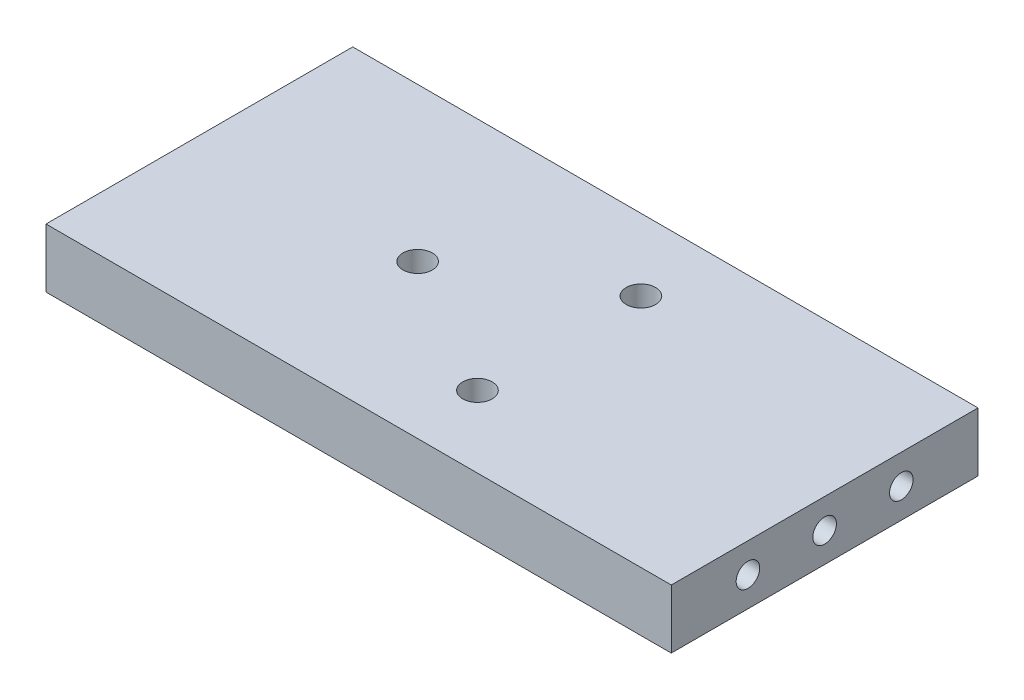
ISO-10303-21;
HEADER;
FILE_DESCRIPTION(('STEP AP214'),'2;1');
FILE_NAME('part.step','',(''),(''),'','','');
FILE_SCHEMA(('AUTOMOTIVE_DESIGN { 1 0 10303 214 1 1 1 1 }'));
ENDSEC;
DATA;
#1=APPLICATION_CONTEXT('core data for automotive mechanical design processes');
#2=APPLICATION_PROTOCOL_DEFINITION('international standard','automotive_design',2000,#1);
#3=PRODUCT_CONTEXT('',#1,'mechanical');
#4=PRODUCT('Part','Part','',(#3));
#5=PRODUCT_RELATED_PRODUCT_CATEGORY('part','',(#4));
#6=PRODUCT_DEFINITION_FORMATION('','',#4);
#7=PRODUCT_DEFINITION_CONTEXT('part definition',#1,'design');
#8=PRODUCT_DEFINITION('design','',#6,#7);
#9=PRODUCT_DEFINITION_SHAPE('','',#8);
#10=(LENGTH_UNIT() NAMED_UNIT(*) SI_UNIT(.MILLI.,.METRE.));
#11=(NAMED_UNIT(*) PLANE_ANGLE_UNIT() SI_UNIT($,.RADIAN.));
#12=(NAMED_UNIT(*) SI_UNIT($,.STERADIAN.) SOLID_ANGLE_UNIT());
#13=UNCERTAINTY_MEASURE_WITH_UNIT(LENGTH_MEASURE(1.E-05),#10,'distance_accuracy_value','');
#14=(GEOMETRIC_REPRESENTATION_CONTEXT(3) GLOBAL_UNCERTAINTY_ASSIGNED_CONTEXT((#13)) GLOBAL_UNIT_ASSIGNED_CONTEXT((#10,
#11,#12)) REPRESENTATION_CONTEXT('',''));
#15=CARTESIAN_POINT('',(0.,0.,0.));
#16=DIRECTION('',(0.,0.,1.));
#17=DIRECTION('',(1.,0.,0.));
#18=AXIS2_PLACEMENT_3D('',#15,#16,#17);
#19=CARTESIAN_POINT('',(0.,5.,0.));
#20=DIRECTION('',(1.,0.,0.));
#21=DIRECTION('',(0.,0.,-1.));
#22=AXIS2_PLACEMENT_3D('',#19,#20,#21);
#23=PLANE('',#22);
#24=CARTESIAN_POINT('',(0.,2.5,-19.5));
#25=DIRECTION('',(-1.,0.,0.));
#26=DIRECTION('',(0.,0.,1.));
#27=AXIS2_PLACEMENT_3D('',#24,#25,#26);
#28=CIRCLE('',#27,0.999999999999989);
#29=CARTESIAN_POINT('',(0.,2.5,-18.5));
#30=VERTEX_POINT('',#29);
#31=EDGE_CURVE('E124',#30,#30,#28,.T.);
#32=ORIENTED_EDGE('',*,*,#31,.F.);
#33=EDGE_LOOP('',(#32));
#34=FACE_BOUND('',#33,.T.);
#35=CARTESIAN_POINT('',(0.,2.5,-13.));
#36=DIRECTION('',(-1.,0.,0.));
#37=DIRECTION('',(0.,0.,1.));
#38=AXIS2_PLACEMENT_3D('',#35,#36,#37);
#39=CIRCLE('',#38,0.999999999999989);
#40=CARTESIAN_POINT('',(0.,2.5,-12.));
#41=VERTEX_POINT('',#40);
#42=EDGE_CURVE('E123',#41,#41,#39,.T.);
#43=ORIENTED_EDGE('',*,*,#42,.F.);
#44=EDGE_LOOP('',(#43));
#45=FACE_BOUND('',#44,.T.);
#46=CARTESIAN_POINT('',(0.,2.5,-6.5));
#47=DIRECTION('',(-1.,0.,0.));
#48=DIRECTION('',(0.,0.,1.));
#49=AXIS2_PLACEMENT_3D('',#46,#47,#48);
#50=CIRCLE('',#49,0.999999999999989);
#51=CARTESIAN_POINT('',(0.,2.5,-5.50000000000001));
#52=VERTEX_POINT('',#51);
#53=EDGE_CURVE('E139',#52,#52,#50,.T.);
#54=ORIENTED_EDGE('',*,*,#53,.F.);
#55=EDGE_LOOP('',(#54));
#56=FACE_BOUND('',#55,.T.);
#57=DIRECTION('',(0.,0.,1.));
#58=VECTOR('',#57,1.);
#59=CARTESIAN_POINT('',(0.,0.,0.));
#60=LINE('',#59,#58);
#61=CARTESIAN_POINT('',(0.,0.,-26.));
#62=VERTEX_POINT('',#61);
#63=CARTESIAN_POINT('',(0.,0.,0.));
#64=VERTEX_POINT('',#63);
#65=EDGE_CURVE('E171',#62,#64,#60,.T.);
#66=ORIENTED_EDGE('',*,*,#65,.T.);
#67=DIRECTION('',(0.,-1.,0.));
#68=VECTOR('',#67,1.);
#69=CARTESIAN_POINT('',(0.,5.,0.));
#70=LINE('',#69,#68);
#71=CARTESIAN_POINT('',(0.,5.,0.));
#72=VERTEX_POINT('',#71);
#73=EDGE_CURVE('E11',#72,#64,#70,.T.);
#74=ORIENTED_EDGE('',*,*,#73,.F.);
#75=DIRECTION('',(0.,0.,1.));
#76=VECTOR('',#75,1.);
#77=CARTESIAN_POINT('',(0.,5.,0.));
#78=LINE('',#77,#76);
#79=CARTESIAN_POINT('',(0.,5.,-26.));
#80=VERTEX_POINT('',#79);
#81=EDGE_CURVE('E172',#80,#72,#78,.T.);
#82=ORIENTED_EDGE('',*,*,#81,.F.);
#83=DIRECTION('',(0.,-1.,0.));
#84=VECTOR('',#83,1.);
#85=CARTESIAN_POINT('',(0.,5.,-26.));
#86=LINE('',#85,#84);
#87=EDGE_CURVE('E182',#80,#62,#86,.T.);
#88=ORIENTED_EDGE('',*,*,#87,.T.);
#89=EDGE_LOOP('',(#66,#74,#82,#88));
#90=FACE_BOUND('',#89,.T.);
#91=ADVANCED_FACE('F45',(#34,#45,#56,#90),#23,.F.);
#92=CARTESIAN_POINT('',(0.,5.,0.));
#93=DIRECTION('',(0.,0.,-1.));
#94=DIRECTION('',(-1.,0.,0.));
#95=AXIS2_PLACEMENT_3D('',#92,#93,#94);
#96=PLANE('',#95);
#97=DIRECTION('',(1.,0.,0.));
#98=VECTOR('',#97,1.);
#99=CARTESIAN_POINT('',(0.,0.,0.));
#100=LINE('',#99,#98);
#101=CARTESIAN_POINT('',(53.,0.,0.));
#102=VERTEX_POINT('',#101);
#103=EDGE_CURVE('E186',#64,#102,#100,.T.);
#104=ORIENTED_EDGE('',*,*,#103,.T.);
#105=DIRECTION('',(0.,-1.,0.));
#106=VECTOR('',#105,1.);
#107=CARTESIAN_POINT('',(53.,5.,0.));
#108=LINE('',#107,#106);
#109=CARTESIAN_POINT('',(53.,5.,0.));
#110=VERTEX_POINT('',#109);
#111=EDGE_CURVE('E54',#110,#102,#108,.T.);
#112=ORIENTED_EDGE('',*,*,#111,.F.);
#113=DIRECTION('',(1.,0.,0.));
#114=VECTOR('',#113,1.);
#115=CARTESIAN_POINT('',(0.,5.,0.));
#116=LINE('',#115,#114);
#117=EDGE_CURVE('E93',#72,#110,#116,.T.);
#118=ORIENTED_EDGE('',*,*,#117,.F.);
#119=ORIENTED_EDGE('',*,*,#73,.T.);
#120=EDGE_LOOP('',(#104,#112,#118,#119));
#121=FACE_BOUND('',#120,.T.);
#122=ADVANCED_FACE('F217',(#121),#96,.F.);
#123=CARTESIAN_POINT('',(53.,5.,0.));
#124=DIRECTION('',(-1.,0.,0.));
#125=DIRECTION('',(0.,0.,1.));
#126=AXIS2_PLACEMENT_3D('',#123,#124,#125);
#127=PLANE('',#126);
#128=CARTESIAN_POINT('',(53.,2.5,-6.5));
#129=DIRECTION('',(1.,0.,0.));
#130=DIRECTION('',(0.,0.,-1.));
#131=AXIS2_PLACEMENT_3D('',#128,#129,#130);
#132=CIRCLE('',#131,0.999999999999989);
#133=CARTESIAN_POINT('',(53.,2.5,-7.49999999999999));
#134=VERTEX_POINT('',#133);
#135=EDGE_CURVE('E147',#134,#134,#132,.T.);
#136=ORIENTED_EDGE('',*,*,#135,.F.);
#137=EDGE_LOOP('',(#136));
#138=FACE_BOUND('',#137,.T.);
#139=CARTESIAN_POINT('',(53.,2.5,-13.));
#140=DIRECTION('',(1.,0.,0.));
#141=DIRECTION('',(0.,0.,-1.));
#142=AXIS2_PLACEMENT_3D('',#139,#140,#141);
#143=CIRCLE('',#142,0.999999999999989);
#144=CARTESIAN_POINT('',(53.,2.5,-14.));
#145=VERTEX_POINT('',#144);
#146=EDGE_CURVE('E155',#145,#145,#143,.T.);
#147=ORIENTED_EDGE('',*,*,#146,.F.);
#148=EDGE_LOOP('',(#147));
#149=FACE_BOUND('',#148,.T.);
#150=CARTESIAN_POINT('',(53.,2.5,-19.5));
#151=DIRECTION('',(1.,0.,0.));
#152=DIRECTION('',(0.,0.,-1.));
#153=AXIS2_PLACEMENT_3D('',#150,#151,#152);
#154=CIRCLE('',#153,0.999999999999989);
#155=CARTESIAN_POINT('',(53.,2.5,-20.5));
#156=VERTEX_POINT('',#155);
#157=EDGE_CURVE('E163',#156,#156,#154,.T.);
#158=ORIENTED_EDGE('',*,*,#157,.F.);
#159=EDGE_LOOP('',(#158));
#160=FACE_BOUND('',#159,.T.);
#161=DIRECTION('',(0.,0.,-1.));
#162=VECTOR('',#161,1.);
#163=CARTESIAN_POINT('',(53.,0.,0.));
#164=LINE('',#163,#162);
#165=CARTESIAN_POINT('',(53.,0.,-26.));
#166=VERTEX_POINT('',#165);
#167=EDGE_CURVE('E80',#102,#166,#164,.T.);
#168=ORIENTED_EDGE('',*,*,#167,.T.);
#169=DIRECTION('',(0.,-1.,0.));
#170=VECTOR('',#169,1.);
#171=CARTESIAN_POINT('',(53.,5.,-26.));
#172=LINE('',#171,#170);
#173=CARTESIAN_POINT('',(53.,5.,-26.));
#174=VERTEX_POINT('',#173);
#175=EDGE_CURVE('E195',#174,#166,#172,.T.);
#176=ORIENTED_EDGE('',*,*,#175,.F.);
#177=DIRECTION('',(0.,0.,-1.));
#178=VECTOR('',#177,1.);
#179=CARTESIAN_POINT('',(53.,5.,0.));
#180=LINE('',#179,#178);
#181=EDGE_CURVE('E177',#110,#174,#180,.T.);
#182=ORIENTED_EDGE('',*,*,#181,.F.);
#183=ORIENTED_EDGE('',*,*,#111,.T.);
#184=EDGE_LOOP('',(#168,#176,#182,#183));
#185=FACE_BOUND('',#184,.T.);
#186=ADVANCED_FACE('F199',(#138,#149,#160,#185),#127,.F.);
#187=CARTESIAN_POINT('',(0.,5.,-26.));
#188=DIRECTION('',(0.,0.,1.));
#189=DIRECTION('',(1.,0.,0.));
#190=AXIS2_PLACEMENT_3D('',#187,#188,#189);
#191=PLANE('',#190);
#192=DIRECTION('',(-1.,0.,0.));
#193=VECTOR('',#192,1.);
#194=CARTESIAN_POINT('',(0.,0.,-26.));
#195=LINE('',#194,#193);
#196=EDGE_CURVE('E86',#166,#62,#195,.T.);
#197=ORIENTED_EDGE('',*,*,#196,.T.);
#198=ORIENTED_EDGE('',*,*,#87,.F.);
#199=DIRECTION('',(-1.,0.,0.));
#200=VECTOR('',#199,1.);
#201=CARTESIAN_POINT('',(0.,5.,-26.));
#202=LINE('',#201,#200);
#203=EDGE_CURVE('E62',#174,#80,#202,.T.);
#204=ORIENTED_EDGE('',*,*,#203,.F.);
#205=ORIENTED_EDGE('',*,*,#175,.T.);
#206=EDGE_LOOP('',(#197,#198,#204,#205));
#207=FACE_BOUND('',#206,.T.);
#208=ADVANCED_FACE('F206',(#207),#191,.F.);
#209=CARTESIAN_POINT('',(0.,5.,0.));
#210=DIRECTION('',(0.,-1.,0.));
#211=DIRECTION('',(0.,0.,-1.));
#212=AXIS2_PLACEMENT_3D('',#209,#210,#211);
#213=PLANE('',#212);
#214=CARTESIAN_POINT('',(18.5,5.,-13.));
#215=DIRECTION('',(0.,1.,0.));
#216=DIRECTION('',(0.,0.,1.));
#217=AXIS2_PLACEMENT_3D('',#214,#215,#216);
#218=CIRCLE('',#217,1.24999999999999);
#219=CARTESIAN_POINT('',(18.5,5.,-11.75));
#220=VERTEX_POINT('',#219);
#221=EDGE_CURVE('E301',#220,#220,#218,.T.);
#222=ORIENTED_EDGE('',*,*,#221,.F.);
#223=EDGE_LOOP('',(#222));
#224=FACE_BOUND('',#223,.T.);
#225=CARTESIAN_POINT('',(30.5,5.,-19.9282032302755));
#226=DIRECTION('',(0.,1.,0.));
#227=DIRECTION('',(0.,0.,1.));
#228=AXIS2_PLACEMENT_3D('',#225,#226,#227);
#229=CIRCLE('',#228,1.24999999999999);
#230=CARTESIAN_POINT('',(30.5,5.,-18.6782032302755));
#231=VERTEX_POINT('',#230);
#232=EDGE_CURVE('E295',#231,#231,#229,.T.);
#233=ORIENTED_EDGE('',*,*,#232,.F.);
#234=EDGE_LOOP('',(#233));
#235=FACE_BOUND('',#234,.T.);
#236=CARTESIAN_POINT('',(30.5,5.,-6.07179676972449));
#237=DIRECTION('',(0.,1.,0.));
#238=DIRECTION('',(0.,0.,1.));
#239=AXIS2_PLACEMENT_3D('',#236,#237,#238);
#240=CIRCLE('',#239,1.24999999999999);
#241=CARTESIAN_POINT('',(30.5,5.,-4.8217967697245));
#242=VERTEX_POINT('',#241);
#243=EDGE_CURVE('E288',#242,#242,#240,.T.);
#244=ORIENTED_EDGE('',*,*,#243,.F.);
#245=EDGE_LOOP('',(#244));
#246=FACE_BOUND('',#245,.T.);
#247=ORIENTED_EDGE('',*,*,#81,.T.);
#248=ORIENTED_EDGE('',*,*,#117,.T.);
#249=ORIENTED_EDGE('',*,*,#181,.T.);
#250=ORIENTED_EDGE('',*,*,#203,.T.);
#251=EDGE_LOOP('',(#247,#248,#249,#250));
#252=FACE_BOUND('',#251,.T.);
#253=ADVANCED_FACE('F208',(#224,#235,#246,#252),#213,.F.);
#254=CARTESIAN_POINT('',(0.,0.,0.));
#255=DIRECTION('',(0.,-1.,0.));
#256=DIRECTION('',(0.,0.,-1.));
#257=AXIS2_PLACEMENT_3D('',#254,#255,#256);
#258=PLANE('',#257);
#259=CARTESIAN_POINT('',(18.5,0.,-13.));
#260=DIRECTION('',(0.,1.,0.));
#261=DIRECTION('',(0.,0.,1.));
#262=AXIS2_PLACEMENT_3D('',#259,#260,#261);
#263=CIRCLE('',#262,1.25);
#264=CARTESIAN_POINT('',(18.5,0.,-11.75));
#265=VERTEX_POINT('',#264);
#266=EDGE_CURVE('E279',#265,#265,#263,.T.);
#267=ORIENTED_EDGE('',*,*,#266,.T.);
#268=EDGE_LOOP('',(#267));
#269=FACE_BOUND('',#268,.T.);
#270=CARTESIAN_POINT('',(30.5,0.,-19.9282032302755));
#271=DIRECTION('',(0.,1.,0.));
#272=DIRECTION('',(0.,0.,1.));
#273=AXIS2_PLACEMENT_3D('',#270,#271,#272);
#274=CIRCLE('',#273,1.25);
#275=CARTESIAN_POINT('',(30.5,0.,-18.6782032302755));
#276=VERTEX_POINT('',#275);
#277=EDGE_CURVE('E283',#276,#276,#274,.T.);
#278=ORIENTED_EDGE('',*,*,#277,.T.);
#279=EDGE_LOOP('',(#278));
#280=FACE_BOUND('',#279,.T.);
#281=CARTESIAN_POINT('',(30.5,0.,-6.07179676972449));
#282=DIRECTION('',(0.,1.,0.));
#283=DIRECTION('',(0.,0.,1.));
#284=AXIS2_PLACEMENT_3D('',#281,#282,#283);
#285=CIRCLE('',#284,1.25);
#286=CARTESIAN_POINT('',(30.5,0.,-4.82179676972449));
#287=VERTEX_POINT('',#286);
#288=EDGE_CURVE('E132',#287,#287,#285,.T.);
#289=ORIENTED_EDGE('',*,*,#288,.T.);
#290=EDGE_LOOP('',(#289));
#291=FACE_BOUND('',#290,.T.);
#292=ORIENTED_EDGE('',*,*,#65,.F.);
#293=ORIENTED_EDGE('',*,*,#196,.F.);
#294=ORIENTED_EDGE('',*,*,#167,.F.);
#295=ORIENTED_EDGE('',*,*,#103,.F.);
#296=EDGE_LOOP('',(#292,#293,#294,#295));
#297=FACE_BOUND('',#296,.T.);
#298=ADVANCED_FACE('F202',(#269,#280,#291,#297),#258,.T.);
#299=CARTESIAN_POINT('',(46.,2.5,-19.5));
#300=DIRECTION('',(1.,0.,0.));
#301=DIRECTION('',(0.,0.,-1.));
#302=AXIS2_PLACEMENT_3D('',#299,#300,#301);
#303=CONICAL_SURFACE('',#302,0.999999999999987,1.02974425867664);
#304=CARTESIAN_POINT('',(45.3991393809724,2.5,-19.5));
#305=VERTEX_POINT('',#304);
#306=VERTEX_LOOP('',#305);
#307=FACE_BOUND('',#306,.T.);
#308=CARTESIAN_POINT('',(46.,2.5,-19.5));
#309=DIRECTION('',(1.,0.,0.));
#310=DIRECTION('',(0.,0.,-1.));
#311=AXIS2_PLACEMENT_3D('',#308,#309,#310);
#312=CIRCLE('',#311,0.999999999999987);
#313=CARTESIAN_POINT('',(46.,2.5,-20.5));
#314=VERTEX_POINT('',#313);
#315=EDGE_CURVE('E167',#314,#314,#312,.T.);
#316=ORIENTED_EDGE('',*,*,#315,.T.);
#317=EDGE_LOOP('',(#316));
#318=FACE_BOUND('',#317,.T.);
#319=ADVANCED_FACE('F267',(#307,#318),#303,.F.);
#320=CARTESIAN_POINT('',(53.,2.5,-19.5));
#321=DIRECTION('',(1.,0.,0.));
#322=DIRECTION('',(0.,0.,-1.));
#323=AXIS2_PLACEMENT_3D('',#320,#321,#322);
#324=CYLINDRICAL_SURFACE('',#323,0.999999999999988);
#325=ORIENTED_EDGE('',*,*,#315,.F.);
#326=EDGE_LOOP('',(#325));
#327=FACE_BOUND('',#326,.T.);
#328=ORIENTED_EDGE('',*,*,#157,.T.);
#329=EDGE_LOOP('',(#328));
#330=FACE_BOUND('',#329,.T.);
#331=ADVANCED_FACE('F263',(#327,#330),#324,.F.);
#332=CARTESIAN_POINT('',(46.,2.5,-13.));
#333=DIRECTION('',(1.,0.,0.));
#334=DIRECTION('',(0.,0.,-1.));
#335=AXIS2_PLACEMENT_3D('',#332,#333,#334);
#336=CONICAL_SURFACE('',#335,0.999999999999987,1.02974425867664);
#337=CARTESIAN_POINT('',(45.3991393809724,2.5,-13.));
#338=VERTEX_POINT('',#337);
#339=VERTEX_LOOP('',#338);
#340=FACE_BOUND('',#339,.T.);
#341=CARTESIAN_POINT('',(46.,2.5,-13.));
#342=DIRECTION('',(1.,0.,0.));
#343=DIRECTION('',(0.,0.,-1.));
#344=AXIS2_PLACEMENT_3D('',#341,#342,#343);
#345=CIRCLE('',#344,0.999999999999987);
#346=CARTESIAN_POINT('',(46.,2.5,-14.));
#347=VERTEX_POINT('',#346);
#348=EDGE_CURVE('E159',#347,#347,#345,.T.);
#349=ORIENTED_EDGE('',*,*,#348,.T.);
#350=EDGE_LOOP('',(#349));
#351=FACE_BOUND('',#350,.T.);
#352=ADVANCED_FACE('F259',(#340,#351),#336,.F.);
#353=CARTESIAN_POINT('',(53.,2.5,-13.));
#354=DIRECTION('',(1.,0.,0.));
#355=DIRECTION('',(0.,0.,-1.));
#356=AXIS2_PLACEMENT_3D('',#353,#354,#355);
#357=CYLINDRICAL_SURFACE('',#356,0.999999999999988);
#358=ORIENTED_EDGE('',*,*,#348,.F.);
#359=EDGE_LOOP('',(#358));
#360=FACE_BOUND('',#359,.T.);
#361=ORIENTED_EDGE('',*,*,#146,.T.);
#362=EDGE_LOOP('',(#361));
#363=FACE_BOUND('',#362,.T.);
#364=ADVANCED_FACE('F255',(#360,#363),#357,.F.);
#365=CARTESIAN_POINT('',(46.,2.5,-6.5));
#366=DIRECTION('',(1.,0.,0.));
#367=DIRECTION('',(0.,0.,-1.));
#368=AXIS2_PLACEMENT_3D('',#365,#366,#367);
#369=CONICAL_SURFACE('',#368,0.999999999999987,1.02974425867664);
#370=CARTESIAN_POINT('',(45.3991393809724,2.5,-6.5));
#371=VERTEX_POINT('',#370);
#372=VERTEX_LOOP('',#371);
#373=FACE_BOUND('',#372,.T.);
#374=CARTESIAN_POINT('',(46.,2.5,-6.5));
#375=DIRECTION('',(1.,0.,0.));
#376=DIRECTION('',(0.,0.,-1.));
#377=AXIS2_PLACEMENT_3D('',#374,#375,#376);
#378=CIRCLE('',#377,0.999999999999987);
#379=CARTESIAN_POINT('',(46.,2.5,-7.49999999999999));
#380=VERTEX_POINT('',#379);
#381=EDGE_CURVE('E151',#380,#380,#378,.T.);
#382=ORIENTED_EDGE('',*,*,#381,.T.);
#383=EDGE_LOOP('',(#382));
#384=FACE_BOUND('',#383,.T.);
#385=ADVANCED_FACE('F251',(#373,#384),#369,.F.);
#386=CARTESIAN_POINT('',(53.,2.5,-6.5));
#387=DIRECTION('',(1.,0.,0.));
#388=DIRECTION('',(0.,0.,-1.));
#389=AXIS2_PLACEMENT_3D('',#386,#387,#388);
#390=CYLINDRICAL_SURFACE('',#389,0.999999999999988);
#391=ORIENTED_EDGE('',*,*,#381,.F.);
#392=EDGE_LOOP('',(#391));
#393=FACE_BOUND('',#392,.T.);
#394=ORIENTED_EDGE('',*,*,#135,.T.);
#395=EDGE_LOOP('',(#394));
#396=FACE_BOUND('',#395,.T.);
#397=ADVANCED_FACE('F244',(#393,#396),#390,.F.);
#398=CARTESIAN_POINT('',(6.99999999999999,2.5,-6.5));
#399=DIRECTION('',(-1.,0.,0.));
#400=DIRECTION('',(0.,0.,1.));
#401=AXIS2_PLACEMENT_3D('',#398,#399,#400);
#402=CONICAL_SURFACE('',#401,0.999999999999987,1.02974425867664);
#403=CARTESIAN_POINT('',(7.60086061902756,2.5,-6.5));
#404=VERTEX_POINT('',#403);
#405=VERTEX_LOOP('',#404);
#406=FACE_BOUND('',#405,.T.);
#407=CARTESIAN_POINT('',(6.99999999999999,2.5,-6.5));
#408=DIRECTION('',(-1.,0.,0.));
#409=DIRECTION('',(0.,0.,1.));
#410=AXIS2_PLACEMENT_3D('',#407,#408,#409);
#411=CIRCLE('',#410,0.999999999999987);
#412=CARTESIAN_POINT('',(6.99999999999999,2.5,-5.50000000000001));
#413=VERTEX_POINT('',#412);
#414=EDGE_CURVE('E143',#413,#413,#411,.T.);
#415=ORIENTED_EDGE('',*,*,#414,.T.);
#416=EDGE_LOOP('',(#415));
#417=FACE_BOUND('',#416,.T.);
#418=ADVANCED_FACE('F236',(#406,#417),#402,.F.);
#419=CARTESIAN_POINT('',(0.,2.5,-6.5));
#420=DIRECTION('',(-1.,0.,0.));
#421=DIRECTION('',(0.,0.,1.));
#422=AXIS2_PLACEMENT_3D('',#419,#420,#421);
#423=CYLINDRICAL_SURFACE('',#422,0.999999999999988);
#424=ORIENTED_EDGE('',*,*,#414,.F.);
#425=EDGE_LOOP('',(#424));
#426=FACE_BOUND('',#425,.T.);
#427=ORIENTED_EDGE('',*,*,#53,.T.);
#428=EDGE_LOOP('',(#427));
#429=FACE_BOUND('',#428,.T.);
#430=ADVANCED_FACE('F233',(#426,#429),#423,.F.);
#431=CARTESIAN_POINT('',(6.99999999999999,2.5,-13.));
#432=DIRECTION('',(-1.,0.,0.));
#433=DIRECTION('',(0.,0.,1.));
#434=AXIS2_PLACEMENT_3D('',#431,#432,#433);
#435=CONICAL_SURFACE('',#434,0.999999999999987,1.02974425867664);
#436=CARTESIAN_POINT('',(7.60086061902756,2.5,-13.));
#437=VERTEX_POINT('',#436);
#438=VERTEX_LOOP('',#437);
#439=FACE_BOUND('',#438,.T.);
#440=CARTESIAN_POINT('',(6.99999999999999,2.5,-13.));
#441=DIRECTION('',(-1.,0.,0.));
#442=DIRECTION('',(0.,0.,1.));
#443=AXIS2_PLACEMENT_3D('',#440,#441,#442);
#444=CIRCLE('',#443,0.999999999999987);
#445=CARTESIAN_POINT('',(6.99999999999999,2.5,-12.));
#446=VERTEX_POINT('',#445);
#447=EDGE_CURVE('E129',#446,#446,#444,.T.);
#448=ORIENTED_EDGE('',*,*,#447,.T.);
#449=EDGE_LOOP('',(#448));
#450=FACE_BOUND('',#449,.T.);
#451=ADVANCED_FACE('F235',(#439,#450),#435,.F.);
#452=CARTESIAN_POINT('',(0.,2.5,-13.));
#453=DIRECTION('',(-1.,0.,0.));
#454=DIRECTION('',(0.,0.,1.));
#455=AXIS2_PLACEMENT_3D('',#452,#453,#454);
#456=CYLINDRICAL_SURFACE('',#455,0.999999999999988);
#457=ORIENTED_EDGE('',*,*,#447,.F.);
#458=EDGE_LOOP('',(#457));
#459=FACE_BOUND('',#458,.T.);
#460=ORIENTED_EDGE('',*,*,#42,.T.);
#461=EDGE_LOOP('',(#460));
#462=FACE_BOUND('',#461,.T.);
#463=ADVANCED_FACE('F116',(#459,#462),#456,.F.);
#464=CARTESIAN_POINT('',(6.99999999999999,2.5,-19.5));
#465=DIRECTION('',(-1.,0.,0.));
#466=DIRECTION('',(0.,0.,1.));
#467=AXIS2_PLACEMENT_3D('',#464,#465,#466);
#468=CONICAL_SURFACE('',#467,0.999999999999987,1.02974425867664);
#469=CARTESIAN_POINT('',(7.60086061902756,2.5,-19.5));
#470=VERTEX_POINT('',#469);
#471=VERTEX_LOOP('',#470);
#472=FACE_BOUND('',#471,.T.);
#473=CARTESIAN_POINT('',(6.99999999999999,2.5,-19.5));
#474=DIRECTION('',(-1.,0.,0.));
#475=DIRECTION('',(0.,0.,1.));
#476=AXIS2_PLACEMENT_3D('',#473,#474,#475);
#477=CIRCLE('',#476,0.999999999999987);
#478=CARTESIAN_POINT('',(6.99999999999999,2.5,-18.5));
#479=VERTEX_POINT('',#478);
#480=EDGE_CURVE('E120',#479,#479,#477,.T.);
#481=ORIENTED_EDGE('',*,*,#480,.T.);
#482=EDGE_LOOP('',(#481));
#483=FACE_BOUND('',#482,.T.);
#484=ADVANCED_FACE('F112',(#472,#483),#468,.F.);
#485=CARTESIAN_POINT('',(0.,2.5,-19.5));
#486=DIRECTION('',(-1.,0.,0.));
#487=DIRECTION('',(0.,0.,1.));
#488=AXIS2_PLACEMENT_3D('',#485,#486,#487);
#489=CYLINDRICAL_SURFACE('',#488,0.999999999999988);
#490=ORIENTED_EDGE('',*,*,#480,.F.);
#491=EDGE_LOOP('',(#490));
#492=FACE_BOUND('',#491,.T.);
#493=ORIENTED_EDGE('',*,*,#31,.T.);
#494=EDGE_LOOP('',(#493));
#495=FACE_BOUND('',#494,.T.);
#496=ADVANCED_FACE('F115',(#492,#495),#489,.F.);
#497=CARTESIAN_POINT('',(30.5,5.,-6.07179676972449));
#498=DIRECTION('',(0.,1.,0.));
#499=DIRECTION('',(0.,0.,1.));
#500=AXIS2_PLACEMENT_3D('',#497,#498,#499);
#501=CYLINDRICAL_SURFACE('',#500,1.24999999999999);
#502=ORIENTED_EDGE('',*,*,#288,.F.);
#503=EDGE_LOOP('',(#502));
#504=FACE_BOUND('',#503,.T.);
#505=ORIENTED_EDGE('',*,*,#243,.T.);
#506=EDGE_LOOP('',(#505));
#507=FACE_BOUND('',#506,.T.);
#508=ADVANCED_FACE('F312',(#504,#507),#501,.F.);
#509=CARTESIAN_POINT('',(30.5,5.,-19.9282032302755));
#510=DIRECTION('',(0.,1.,0.));
#511=DIRECTION('',(0.,0.,1.));
#512=AXIS2_PLACEMENT_3D('',#509,#510,#511);
#513=CYLINDRICAL_SURFACE('',#512,1.24999999999999);
#514=ORIENTED_EDGE('',*,*,#277,.F.);
#515=EDGE_LOOP('',(#514));
#516=FACE_BOUND('',#515,.T.);
#517=ORIENTED_EDGE('',*,*,#232,.T.);
#518=EDGE_LOOP('',(#517));
#519=FACE_BOUND('',#518,.T.);
#520=ADVANCED_FACE('F313',(#516,#519),#513,.F.);
#521=CARTESIAN_POINT('',(18.5,5.,-13.));
#522=DIRECTION('',(0.,1.,0.));
#523=DIRECTION('',(0.,0.,1.));
#524=AXIS2_PLACEMENT_3D('',#521,#522,#523);
#525=CYLINDRICAL_SURFACE('',#524,1.24999999999999);
#526=ORIENTED_EDGE('',*,*,#266,.F.);
#527=EDGE_LOOP('',(#526));
#528=FACE_BOUND('',#527,.T.);
#529=ORIENTED_EDGE('',*,*,#221,.T.);
#530=EDGE_LOOP('',(#529));
#531=FACE_BOUND('',#530,.T.);
#532=ADVANCED_FACE('F306',(#528,#531),#525,.F.);
#533=CLOSED_SHELL('',(#91,#122,#186,#208,#253,#298,#319,#331,#352,#364,#385,#397,#418,#430,#451,
#463,#484,#496,#508,#520,#532));
#534=MANIFOLD_SOLID_BREP('B2',#533);
#535=ADVANCED_BREP_SHAPE_REPRESENTATION('',(#18,#534),#14);
#536=SHAPE_DEFINITION_REPRESENTATION(#9,#535);
ENDSEC;
END-ISO-10303-21;
